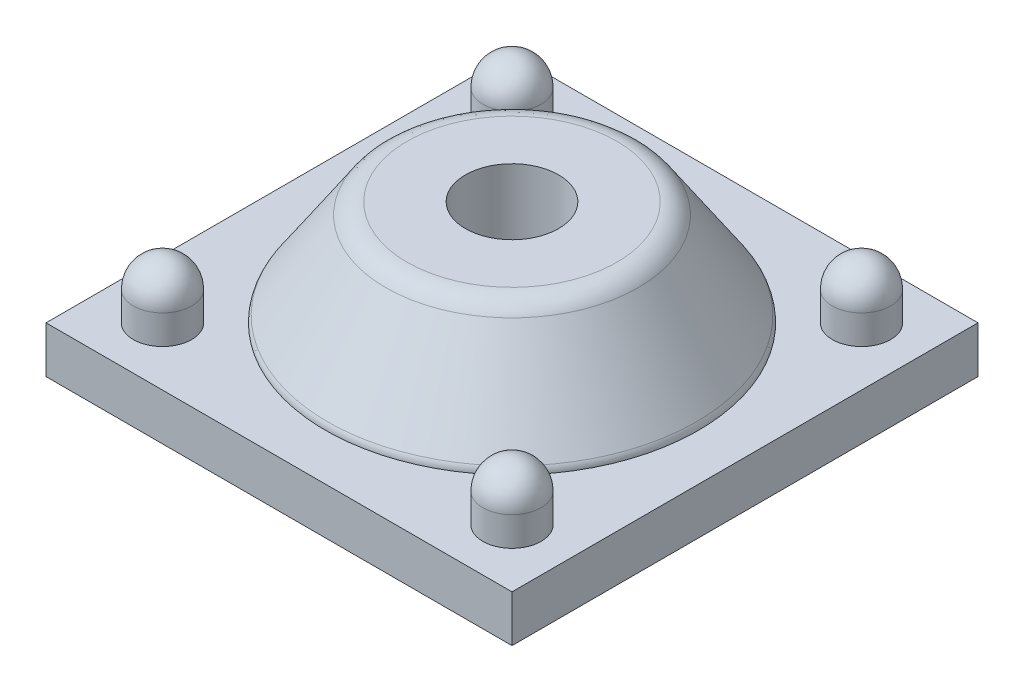
ISO-10303-21;
HEADER;
FILE_DESCRIPTION(('STEP AP214'),'2;1');
FILE_NAME('part.step','',(''),(''),'','','');
FILE_SCHEMA(('AUTOMOTIVE_DESIGN { 1 0 10303 214 1 1 1 1 }'));
ENDSEC;
DATA;
#1=APPLICATION_CONTEXT('core data for automotive mechanical design processes');
#2=APPLICATION_PROTOCOL_DEFINITION('international standard','automotive_design',2000,#1);
#3=PRODUCT_CONTEXT('',#1,'mechanical');
#4=PRODUCT('Part','Part','',(#3));
#5=PRODUCT_RELATED_PRODUCT_CATEGORY('part','',(#4));
#6=PRODUCT_DEFINITION_FORMATION('','',#4);
#7=PRODUCT_DEFINITION_CONTEXT('part definition',#1,'design');
#8=PRODUCT_DEFINITION('design','',#6,#7);
#9=PRODUCT_DEFINITION_SHAPE('','',#8);
#10=(LENGTH_UNIT() NAMED_UNIT(*) SI_UNIT(.MILLI.,.METRE.));
#11=(NAMED_UNIT(*) PLANE_ANGLE_UNIT() SI_UNIT($,.RADIAN.));
#12=(NAMED_UNIT(*) SI_UNIT($,.STERADIAN.) SOLID_ANGLE_UNIT());
#13=UNCERTAINTY_MEASURE_WITH_UNIT(LENGTH_MEASURE(1.E-05),#10,'distance_accuracy_value','');
#14=(GEOMETRIC_REPRESENTATION_CONTEXT(3) GLOBAL_UNCERTAINTY_ASSIGNED_CONTEXT((#13)) GLOBAL_UNIT_ASSIGNED_CONTEXT((#10,
#11,#12)) REPRESENTATION_CONTEXT('',''));
#15=CARTESIAN_POINT('',(0.,0.,0.));
#16=DIRECTION('',(0.,0.,1.));
#17=DIRECTION('',(1.,0.,0.));
#18=AXIS2_PLACEMENT_3D('',#15,#16,#17);
#19=CARTESIAN_POINT('',(0.,0.,0.));
#20=DIRECTION('',(0.,-1.,0.));
#21=DIRECTION('',(0.,0.,-1.));
#22=AXIS2_PLACEMENT_3D('',#19,#20,#21);
#23=CYLINDRICAL_SURFACE('',#22,4.);
#24=CARTESIAN_POINT('',(0.,0.,0.));
#25=DIRECTION('',(0.,-1.,0.));
#26=DIRECTION('',(0.,0.,-1.));
#27=AXIS2_PLACEMENT_3D('',#24,#25,#26);
#28=CIRCLE('',#27,4.);
#29=CARTESIAN_POINT('',(0.,0.,-4.));
#30=VERTEX_POINT('',#29);
#31=EDGE_CURVE('E115',#30,#30,#28,.T.);
#32=ORIENTED_EDGE('',*,*,#31,.T.);
#33=EDGE_LOOP('',(#32));
#34=FACE_BOUND('',#33,.T.);
#35=CARTESIAN_POINT('',(0.,10.,0.));
#36=DIRECTION('',(0.,-1.,0.));
#37=DIRECTION('',(0.,0.,-1.));
#38=AXIS2_PLACEMENT_3D('',#35,#36,#37);
#39=CIRCLE('',#38,4.);
#40=CARTESIAN_POINT('',(0.,10.,-4.));
#41=VERTEX_POINT('',#40);
#42=EDGE_CURVE('E112',#41,#41,#39,.T.);
#43=ORIENTED_EDGE('',*,*,#42,.F.);
#44=EDGE_LOOP('',(#43));
#45=FACE_BOUND('',#44,.T.);
#46=ADVANCED_FACE('F35',(#34,#45),#23,.F.);
#47=CARTESIAN_POINT('',(4.,10.,0.));
#48=DIRECTION('',(0.,1.,0.));
#49=DIRECTION('',(0.,0.,1.));
#50=AXIS2_PLACEMENT_3D('',#47,#48,#49);
#51=PLANE('',#50);
#52=ORIENTED_EDGE('',*,*,#42,.T.);
#53=EDGE_LOOP('',(#52));
#54=FACE_BOUND('',#53,.T.);
#55=CARTESIAN_POINT('',(0.,10.,0.));
#56=DIRECTION('',(0.,-1.,0.));
#57=DIRECTION('',(0.,0.,-1.));
#58=AXIS2_PLACEMENT_3D('',#55,#56,#57);
#59=CIRCLE('',#58,9.);
#60=CARTESIAN_POINT('',(0.,10.,-9.));
#61=VERTEX_POINT('',#60);
#62=EDGE_CURVE('E109',#61,#61,#59,.T.);
#63=ORIENTED_EDGE('',*,*,#62,.F.);
#64=EDGE_LOOP('',(#63));
#65=FACE_BOUND('',#64,.T.);
#66=ADVANCED_FACE('F166',(#54,#65),#51,.T.);
#67=CARTESIAN_POINT('',(0.,7.79657920417591,0.));
#68=DIRECTION('',(0.,-1.,0.));
#69=DIRECTION('',(0.,0.,-1.));
#70=AXIS2_PLACEMENT_3D('',#67,#68,#69);
#71=TOROIDAL_SURFACE('',#70,9.,2.20342079582409);
#72=ORIENTED_EDGE('',*,*,#62,.T.);
#73=EDGE_LOOP('',(#72));
#74=FACE_BOUND('',#73,.T.);
#75=CARTESIAN_POINT('',(0.,9.02265422434769,0.));
#76=DIRECTION('',(0.,-1.,0.));
#77=DIRECTION('',(0.,0.,-1.));
#78=AXIS2_PLACEMENT_3D('',#75,#76,#77);
#79=CIRCLE('',#78,10.8307930654175);
#80=CARTESIAN_POINT('',(0.,9.02265422434769,-10.8307930654175));
#81=VERTEX_POINT('',#80);
#82=EDGE_CURVE('E106',#81,#81,#79,.T.);
#83=ORIENTED_EDGE('',*,*,#82,.F.);
#84=EDGE_LOOP('',(#83));
#85=FACE_BOUND('',#84,.T.);
#86=ADVANCED_FACE('F160',(#74,#85),#71,.T.);
#87=CARTESIAN_POINT('',(0.,1.55644161228551,0.));
#88=DIRECTION('',(0.,-1.,0.));
#89=DIRECTION('',(0.,0.,-1.));
#90=AXIS2_PLACEMENT_3D('',#87,#88,#89);
#91=CONICAL_SURFACE('',#90,15.8308867143703,0.590096988860552);
#92=ORIENTED_EDGE('',*,*,#82,.T.);
#93=EDGE_LOOP('',(#92));
#94=FACE_BOUND('',#93,.T.);
#95=CARTESIAN_POINT('',(0.,1.55644161228551,0.));
#96=DIRECTION('',(0.,-1.,0.));
#97=DIRECTION('',(0.,0.,-1.));
#98=AXIS2_PLACEMENT_3D('',#95,#96,#97);
#99=CIRCLE('',#98,15.8308867143703);
#100=CARTESIAN_POINT('',(0.,1.55644161228551,-15.8308867143703));
#101=VERTEX_POINT('',#100);
#102=EDGE_CURVE('E103',#101,#101,#99,.T.);
#103=ORIENTED_EDGE('',*,*,#102,.F.);
#104=EDGE_LOOP('',(#103));
#105=FACE_BOUND('',#104,.T.);
#106=ADVANCED_FACE('F155',(#94,#105),#91,.T.);
#107=CARTESIAN_POINT('',(0.,1.,0.));
#108=DIRECTION('',(0.,-1.,0.));
#109=DIRECTION('',(0.,0.,-1.));
#110=AXIS2_PLACEMENT_3D('',#107,#108,#109);
#111=TOROIDAL_SURFACE('',#110,15.,1.);
#112=CARTESIAN_POINT('',(0.,1.,0.));
#113=DIRECTION('',(0.,-1.,0.));
#114=DIRECTION('',(0.,0.,-1.));
#115=AXIS2_PLACEMENT_3D('',#112,#113,#114);
#116=CIRCLE('',#115,16.);
#117=CARTESIAN_POINT('',(0.,1.,-16.));
#118=VERTEX_POINT('',#117);
#119=EDGE_CURVE('E97',#118,#118,#116,.T.);
#120=ORIENTED_EDGE('',*,*,#119,.F.);
#121=EDGE_LOOP('',(#120));
#122=FACE_BOUND('',#121,.T.);
#123=ORIENTED_EDGE('',*,*,#102,.T.);
#124=EDGE_LOOP('',(#123));
#125=FACE_BOUND('',#124,.T.);
#126=ADVANCED_FACE('F152',(#122,#125),#111,.T.);
#127=CARTESIAN_POINT('',(0.,0.,0.));
#128=DIRECTION('',(0.,-1.,0.));
#129=DIRECTION('',(0.,0.,-1.));
#130=AXIS2_PLACEMENT_3D('',#127,#128,#129);
#131=PLANE('',#130);
#132=ORIENTED_EDGE('',*,*,#31,.F.);
#133=EDGE_LOOP('',(#132));
#134=FACE_BOUND('',#133,.T.);
#135=ADVANCED_FACE('F143',(#134),#131,.F.);
#136=CARTESIAN_POINT('',(0.,1.,0.));
#137=DIRECTION('',(0.,-1.,0.));
#138=DIRECTION('',(0.,0.,-1.));
#139=AXIS2_PLACEMENT_3D('',#136,#137,#138);
#140=PLANE('',#139);
#141=CARTESIAN_POINT('',(14.9999999999998,1.,15.0000000000002));
#142=DIRECTION('',(0.,-1.,0.));
#143=DIRECTION('',(0.,0.,-1.));
#144=AXIS2_PLACEMENT_3D('',#141,#142,#143);
#145=CIRCLE('',#144,2.5);
#146=CARTESIAN_POINT('',(14.9999999999998,1.,12.5000000000002));
#147=VERTEX_POINT('',#146);
#148=EDGE_CURVE('E11',#147,#147,#145,.F.);
#149=ORIENTED_EDGE('',*,*,#148,.F.);
#150=EDGE_LOOP('',(#149));
#151=FACE_BOUND('',#150,.T.);
#152=CARTESIAN_POINT('',(15.,1.,-15.));
#153=DIRECTION('',(0.,-1.,0.));
#154=DIRECTION('',(0.,0.,-1.));
#155=AXIS2_PLACEMENT_3D('',#152,#153,#154);
#156=CIRCLE('',#155,2.5);
#157=CARTESIAN_POINT('',(15.,1.,-17.5));
#158=VERTEX_POINT('',#157);
#159=EDGE_CURVE('E43',#158,#158,#156,.F.);
#160=ORIENTED_EDGE('',*,*,#159,.F.);
#161=EDGE_LOOP('',(#160));
#162=FACE_BOUND('',#161,.T.);
#163=CARTESIAN_POINT('',(-14.9999999999999,1.,-15.));
#164=DIRECTION('',(0.,-1.,0.));
#165=DIRECTION('',(0.,0.,-1.));
#166=AXIS2_PLACEMENT_3D('',#163,#164,#165);
#167=CIRCLE('',#166,2.5);
#168=CARTESIAN_POINT('',(-14.9999999999999,1.,-17.5));
#169=VERTEX_POINT('',#168);
#170=EDGE_CURVE('E133',#169,#169,#167,.F.);
#171=ORIENTED_EDGE('',*,*,#170,.F.);
#172=EDGE_LOOP('',(#171));
#173=FACE_BOUND('',#172,.T.);
#174=CARTESIAN_POINT('',(-15.,1.,15.));
#175=DIRECTION('',(0.,-1.,0.));
#176=DIRECTION('',(0.,0.,-1.));
#177=AXIS2_PLACEMENT_3D('',#174,#175,#176);
#178=CIRCLE('',#177,2.5);
#179=CARTESIAN_POINT('',(-15.,1.,12.5));
#180=VERTEX_POINT('',#179);
#181=EDGE_CURVE('E127',#180,#180,#178,.F.);
#182=ORIENTED_EDGE('',*,*,#181,.F.);
#183=EDGE_LOOP('',(#182));
#184=FACE_BOUND('',#183,.T.);
#185=ORIENTED_EDGE('',*,*,#119,.T.);
#186=EDGE_LOOP('',(#185));
#187=FACE_BOUND('',#186,.T.);
#188=DIRECTION('',(0.,0.,-1.));
#189=VECTOR('',#188,1.);
#190=CARTESIAN_POINT('',(-20.,1.,-20.));
#191=LINE('',#190,#189);
#192=CARTESIAN_POINT('',(-20.,1.,20.));
#193=VERTEX_POINT('',#192);
#194=CARTESIAN_POINT('',(-20.,1.,-20.));
#195=VERTEX_POINT('',#194);
#196=EDGE_CURVE('E79',#193,#195,#191,.T.);
#197=ORIENTED_EDGE('',*,*,#196,.F.);
#198=DIRECTION('',(-1.,0.,0.));
#199=VECTOR('',#198,1.);
#200=CARTESIAN_POINT('',(-20.,1.,20.));
#201=LINE('',#200,#199);
#202=CARTESIAN_POINT('',(20.,1.,20.));
#203=VERTEX_POINT('',#202);
#204=EDGE_CURVE('E90',#203,#193,#201,.T.);
#205=ORIENTED_EDGE('',*,*,#204,.F.);
#206=DIRECTION('',(0.,0.,1.));
#207=VECTOR('',#206,1.);
#208=CARTESIAN_POINT('',(20.,1.,20.));
#209=LINE('',#208,#207);
#210=CARTESIAN_POINT('',(20.,1.,-20.));
#211=VERTEX_POINT('',#210);
#212=EDGE_CURVE('E95',#211,#203,#209,.T.);
#213=ORIENTED_EDGE('',*,*,#212,.F.);
#214=DIRECTION('',(1.,0.,0.));
#215=VECTOR('',#214,1.);
#216=CARTESIAN_POINT('',(20.,1.,-20.));
#217=LINE('',#216,#215);
#218=EDGE_CURVE('E92',#195,#211,#217,.T.);
#219=ORIENTED_EDGE('',*,*,#218,.F.);
#220=EDGE_LOOP('',(#197,#205,#213,#219));
#221=FACE_BOUND('',#220,.T.);
#222=ADVANCED_FACE('F88',(#151,#162,#173,#184,#187,#221),#140,.F.);
#223=CARTESIAN_POINT('',(0.,-3.,0.));
#224=DIRECTION('',(0.,-1.,0.));
#225=DIRECTION('',(0.,0.,-1.));
#226=AXIS2_PLACEMENT_3D('',#223,#224,#225);
#227=PLANE('',#226);
#228=DIRECTION('',(0.,0.,-1.));
#229=VECTOR('',#228,1.);
#230=CARTESIAN_POINT('',(20.,-3.,20.));
#231=LINE('',#230,#229);
#232=CARTESIAN_POINT('',(20.,-3.,20.));
#233=VERTEX_POINT('',#232);
#234=CARTESIAN_POINT('',(20.,-3.,-20.));
#235=VERTEX_POINT('',#234);
#236=EDGE_CURVE('E118',#233,#235,#231,.T.);
#237=ORIENTED_EDGE('',*,*,#236,.F.);
#238=DIRECTION('',(1.,0.,0.));
#239=VECTOR('',#238,1.);
#240=CARTESIAN_POINT('',(-20.,-3.,20.));
#241=LINE('',#240,#239);
#242=CARTESIAN_POINT('',(-20.,-3.,20.));
#243=VERTEX_POINT('',#242);
#244=EDGE_CURVE('E124',#243,#233,#241,.T.);
#245=ORIENTED_EDGE('',*,*,#244,.F.);
#246=DIRECTION('',(0.,0.,1.));
#247=VECTOR('',#246,1.);
#248=CARTESIAN_POINT('',(-20.,-3.,20.));
#249=LINE('',#248,#247);
#250=CARTESIAN_POINT('',(-20.,-3.,-20.));
#251=VERTEX_POINT('',#250);
#252=EDGE_CURVE('E81',#251,#243,#249,.T.);
#253=ORIENTED_EDGE('',*,*,#252,.F.);
#254=DIRECTION('',(-1.,0.,0.));
#255=VECTOR('',#254,1.);
#256=CARTESIAN_POINT('',(-20.,-3.,-20.));
#257=LINE('',#256,#255);
#258=EDGE_CURVE('E120',#235,#251,#257,.T.);
#259=ORIENTED_EDGE('',*,*,#258,.F.);
#260=EDGE_LOOP('',(#237,#245,#253,#259));
#261=FACE_BOUND('',#260,.T.);
#262=ADVANCED_FACE('F142',(#261),#227,.T.);
#263=CARTESIAN_POINT('',(20.,-3.,20.));
#264=DIRECTION('',(1.,0.,0.));
#265=DIRECTION('',(0.,0.,-1.));
#266=AXIS2_PLACEMENT_3D('',#263,#264,#265);
#267=PLANE('',#266);
#268=DIRECTION('',(0.,1.,0.));
#269=VECTOR('',#268,1.);
#270=CARTESIAN_POINT('',(20.,-3.,-20.));
#271=LINE('',#270,#269);
#272=EDGE_CURVE('E126',#235,#211,#271,.T.);
#273=ORIENTED_EDGE('',*,*,#272,.T.);
#274=ORIENTED_EDGE('',*,*,#212,.T.);
#275=DIRECTION('',(0.,1.,0.));
#276=VECTOR('',#275,1.);
#277=CARTESIAN_POINT('',(20.,-3.,20.));
#278=LINE('',#277,#276);
#279=EDGE_CURVE('E50',#233,#203,#278,.T.);
#280=ORIENTED_EDGE('',*,*,#279,.F.);
#281=ORIENTED_EDGE('',*,*,#236,.T.);
#282=EDGE_LOOP('',(#273,#274,#280,#281));
#283=FACE_BOUND('',#282,.T.);
#284=ADVANCED_FACE('F37',(#283),#267,.T.);
#285=CARTESIAN_POINT('',(-20.,-3.,20.));
#286=DIRECTION('',(0.,0.,1.));
#287=DIRECTION('',(1.,0.,0.));
#288=AXIS2_PLACEMENT_3D('',#285,#286,#287);
#289=PLANE('',#288);
#290=ORIENTED_EDGE('',*,*,#279,.T.);
#291=ORIENTED_EDGE('',*,*,#204,.T.);
#292=DIRECTION('',(0.,1.,0.));
#293=VECTOR('',#292,1.);
#294=CARTESIAN_POINT('',(-20.,-3.,20.));
#295=LINE('',#294,#293);
#296=EDGE_CURVE('E58',#243,#193,#295,.T.);
#297=ORIENTED_EDGE('',*,*,#296,.F.);
#298=ORIENTED_EDGE('',*,*,#244,.T.);
#299=EDGE_LOOP('',(#290,#291,#297,#298));
#300=FACE_BOUND('',#299,.T.);
#301=ADVANCED_FACE('F94',(#300),#289,.T.);
#302=CARTESIAN_POINT('',(-20.,-3.,20.));
#303=DIRECTION('',(-1.,0.,0.));
#304=DIRECTION('',(0.,0.,1.));
#305=AXIS2_PLACEMENT_3D('',#302,#303,#304);
#306=PLANE('',#305);
#307=ORIENTED_EDGE('',*,*,#296,.T.);
#308=ORIENTED_EDGE('',*,*,#196,.T.);
#309=DIRECTION('',(0.,1.,0.));
#310=VECTOR('',#309,1.);
#311=CARTESIAN_POINT('',(-20.,-3.,-20.));
#312=LINE('',#311,#310);
#313=EDGE_CURVE('E83',#251,#195,#312,.T.);
#314=ORIENTED_EDGE('',*,*,#313,.F.);
#315=ORIENTED_EDGE('',*,*,#252,.T.);
#316=EDGE_LOOP('',(#307,#308,#314,#315));
#317=FACE_BOUND('',#316,.T.);
#318=ADVANCED_FACE('F78',(#317),#306,.T.);
#319=CARTESIAN_POINT('',(-20.,-3.,-20.));
#320=DIRECTION('',(0.,0.,-1.));
#321=DIRECTION('',(-1.,0.,0.));
#322=AXIS2_PLACEMENT_3D('',#319,#320,#321);
#323=PLANE('',#322);
#324=ORIENTED_EDGE('',*,*,#313,.T.);
#325=ORIENTED_EDGE('',*,*,#218,.T.);
#326=ORIENTED_EDGE('',*,*,#272,.F.);
#327=ORIENTED_EDGE('',*,*,#258,.T.);
#328=EDGE_LOOP('',(#324,#325,#326,#327));
#329=FACE_BOUND('',#328,.T.);
#330=ADVANCED_FACE('F188',(#329),#323,.T.);
#331=CARTESIAN_POINT('',(-15.,6.92367340873769,15.));
#332=DIRECTION('',(0.,1.,0.));
#333=DIRECTION('',(-1.,0.,0.));
#334=AXIS2_PLACEMENT_3D('',#331,#332,#333);
#335=CYLINDRICAL_SURFACE('',#334,2.5);
#336=CARTESIAN_POINT('',(-15.,3.5,15.));
#337=DIRECTION('',(0.,1.,0.));
#338=DIRECTION('',(-1.,0.,0.));
#339=AXIS2_PLACEMENT_3D('',#336,#337,#338);
#340=CIRCLE('',#339,2.5);
#341=CARTESIAN_POINT('',(-17.5,3.5,15.));
#342=VERTEX_POINT('',#341);
#343=EDGE_CURVE('E315',#342,#342,#340,.T.);
#344=ORIENTED_EDGE('',*,*,#343,.F.);
#345=EDGE_LOOP('',(#344));
#346=FACE_BOUND('',#345,.T.);
#347=ORIENTED_EDGE('',*,*,#181,.T.);
#348=EDGE_LOOP('',(#347));
#349=FACE_BOUND('',#348,.T.);
#350=ADVANCED_FACE('F190',(#346,#349),#335,.T.);
#351=CARTESIAN_POINT('',(-15.,3.5,15.));
#352=DIRECTION('',(0.,1.,0.));
#353=DIRECTION('',(1.,0.,0.));
#354=AXIS2_PLACEMENT_3D('',#351,#352,#353);
#355=SPHERICAL_SURFACE('',#354,2.5);
#356=ORIENTED_EDGE('',*,*,#343,.T.);
#357=EDGE_LOOP('',(#356));
#358=FACE_BOUND('',#357,.T.);
#359=ADVANCED_FACE('F195',(#358),#355,.T.);
#360=CARTESIAN_POINT('',(-14.9999999999999,6.92367340873769,-15.0000000000001));
#361=DIRECTION('',(0.,1.,0.));
#362=DIRECTION('',(0.,0.,-1.));
#363=AXIS2_PLACEMENT_3D('',#360,#361,#362);
#364=CYLINDRICAL_SURFACE('',#363,2.5);
#365=CARTESIAN_POINT('',(-14.9999999999999,3.5,-15.0000000000001));
#366=DIRECTION('',(0.,1.,0.));
#367=DIRECTION('',(0.,0.,-1.));
#368=AXIS2_PLACEMENT_3D('',#365,#366,#367);
#369=CIRCLE('',#368,2.5);
#370=CARTESIAN_POINT('',(-14.9999999999999,3.5,-17.5000000000001));
#371=VERTEX_POINT('',#370);
#372=EDGE_CURVE('E310',#371,#371,#369,.T.);
#373=ORIENTED_EDGE('',*,*,#372,.F.);
#374=EDGE_LOOP('',(#373));
#375=FACE_BOUND('',#374,.T.);
#376=ORIENTED_EDGE('',*,*,#170,.T.);
#377=EDGE_LOOP('',(#376));
#378=FACE_BOUND('',#377,.T.);
#379=ADVANCED_FACE('F234',(#375,#378),#364,.T.);
#380=CARTESIAN_POINT('',(-14.9999999999999,3.5,-15.0000000000001));
#381=DIRECTION('',(0.,1.,0.));
#382=DIRECTION('',(0.,0.,1.));
#383=AXIS2_PLACEMENT_3D('',#380,#381,#382);
#384=SPHERICAL_SURFACE('',#383,2.5);
#385=ORIENTED_EDGE('',*,*,#372,.T.);
#386=EDGE_LOOP('',(#385));
#387=FACE_BOUND('',#386,.T.);
#388=ADVANCED_FACE('F251',(#387),#384,.T.);
#389=CARTESIAN_POINT('',(15.,6.92367340873769,-15.));
#390=DIRECTION('',(0.,1.,0.));
#391=DIRECTION('',(1.,0.,0.));
#392=AXIS2_PLACEMENT_3D('',#389,#390,#391);
#393=CYLINDRICAL_SURFACE('',#392,2.5);
#394=CARTESIAN_POINT('',(15.,3.5,-15.));
#395=DIRECTION('',(0.,1.,0.));
#396=DIRECTION('',(1.,0.,0.));
#397=AXIS2_PLACEMENT_3D('',#394,#395,#396);
#398=CIRCLE('',#397,2.5);
#399=CARTESIAN_POINT('',(17.5,3.5,-15.));
#400=VERTEX_POINT('',#399);
#401=EDGE_CURVE('E307',#400,#400,#398,.T.);
#402=ORIENTED_EDGE('',*,*,#401,.F.);
#403=EDGE_LOOP('',(#402));
#404=FACE_BOUND('',#403,.T.);
#405=ORIENTED_EDGE('',*,*,#159,.T.);
#406=EDGE_LOOP('',(#405));
#407=FACE_BOUND('',#406,.T.);
#408=ADVANCED_FACE('F138',(#404,#407),#393,.T.);
#409=CARTESIAN_POINT('',(15.,3.5,-15.));
#410=DIRECTION('',(0.,1.,0.));
#411=DIRECTION('',(-1.,0.,0.));
#412=AXIS2_PLACEMENT_3D('',#409,#410,#411);
#413=SPHERICAL_SURFACE('',#412,2.5);
#414=ORIENTED_EDGE('',*,*,#401,.T.);
#415=EDGE_LOOP('',(#414));
#416=FACE_BOUND('',#415,.T.);
#417=ADVANCED_FACE('F270',(#416),#413,.T.);
#418=CARTESIAN_POINT('',(14.9999999999998,6.92367340873769,15.0000000000002));
#419=DIRECTION('',(0.,1.,0.));
#420=DIRECTION('',(0.,0.,1.));
#421=AXIS2_PLACEMENT_3D('',#418,#419,#420);
#422=CYLINDRICAL_SURFACE('',#421,2.5);
#423=CARTESIAN_POINT('',(14.9999999999998,3.5,15.0000000000002));
#424=DIRECTION('',(0.,1.,0.));
#425=DIRECTION('',(0.,0.,1.));
#426=AXIS2_PLACEMENT_3D('',#423,#424,#425);
#427=CIRCLE('',#426,2.5);
#428=CARTESIAN_POINT('',(14.9999999999998,3.5,17.5000000000002));
#429=VERTEX_POINT('',#428);
#430=EDGE_CURVE('E306',#429,#429,#427,.T.);
#431=ORIENTED_EDGE('',*,*,#430,.F.);
#432=EDGE_LOOP('',(#431));
#433=FACE_BOUND('',#432,.T.);
#434=ORIENTED_EDGE('',*,*,#148,.T.);
#435=EDGE_LOOP('',(#434));
#436=FACE_BOUND('',#435,.T.);
#437=ADVANCED_FACE('F280',(#433,#436),#422,.T.);
#438=CARTESIAN_POINT('',(14.9999999999998,3.5,15.0000000000002));
#439=DIRECTION('',(0.,1.,0.));
#440=DIRECTION('',(0.,0.,-1.));
#441=AXIS2_PLACEMENT_3D('',#438,#439,#440);
#442=SPHERICAL_SURFACE('',#441,2.5);
#443=ORIENTED_EDGE('',*,*,#430,.T.);
#444=EDGE_LOOP('',(#443));
#445=FACE_BOUND('',#444,.T.);
#446=ADVANCED_FACE('F290',(#445),#442,.T.);
#447=CLOSED_SHELL('',(#46,#66,#86,#106,#126,#135,#222,#262,#284,#301,#318,#330,#350,#359,#379,
#388,#408,#417,#437,#446));
#448=MANIFOLD_SOLID_BREP('B2',#447);
#449=ADVANCED_BREP_SHAPE_REPRESENTATION('',(#18,#448),#14);
#450=SHAPE_DEFINITION_REPRESENTATION(#9,#449);
ENDSEC;
END-ISO-10303-21;
